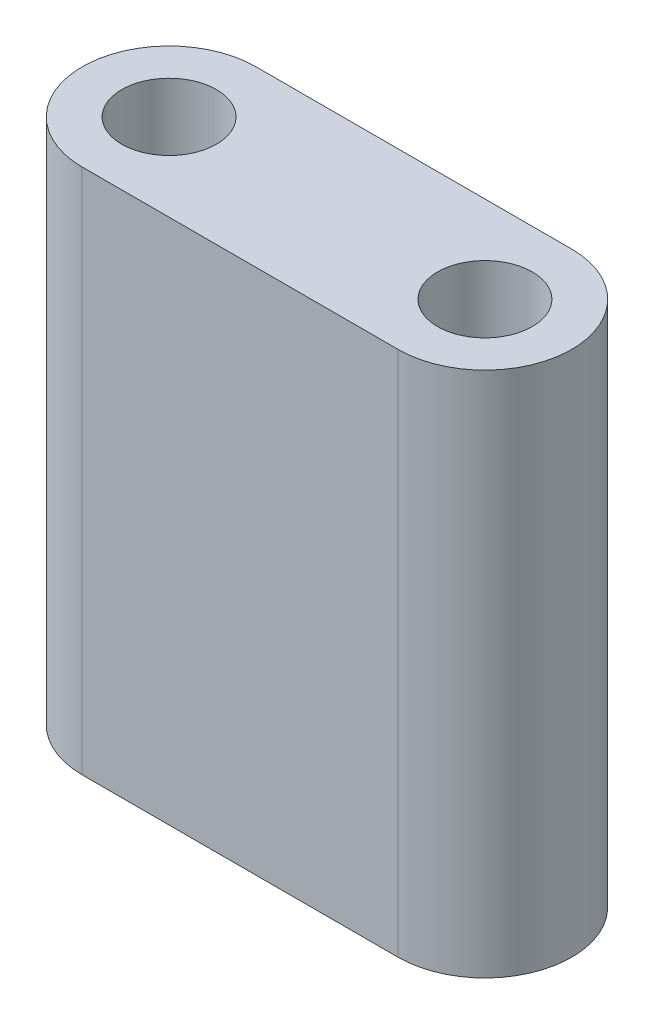
ISO-10303-21;
HEADER;
FILE_DESCRIPTION(('STEP AP214'),'2;1');
FILE_NAME('part.step','',(''),(''),'','','');
FILE_SCHEMA(('AUTOMOTIVE_DESIGN { 1 0 10303 214 1 1 1 1 }'));
ENDSEC;
DATA;
#1=APPLICATION_CONTEXT('core data for automotive mechanical design processes');
#2=APPLICATION_PROTOCOL_DEFINITION('international standard','automotive_design',2000,#1);
#3=PRODUCT_CONTEXT('',#1,'mechanical');
#4=PRODUCT('Part','Part','',(#3));
#5=PRODUCT_RELATED_PRODUCT_CATEGORY('part','',(#4));
#6=PRODUCT_DEFINITION_FORMATION('','',#4);
#7=PRODUCT_DEFINITION_CONTEXT('part definition',#1,'design');
#8=PRODUCT_DEFINITION('design','',#6,#7);
#9=PRODUCT_DEFINITION_SHAPE('','',#8);
#10=(LENGTH_UNIT() NAMED_UNIT(*) SI_UNIT(.MILLI.,.METRE.));
#11=(NAMED_UNIT(*) PLANE_ANGLE_UNIT() SI_UNIT($,.RADIAN.));
#12=(NAMED_UNIT(*) SI_UNIT($,.STERADIAN.) SOLID_ANGLE_UNIT());
#13=UNCERTAINTY_MEASURE_WITH_UNIT(LENGTH_MEASURE(1.E-05),#10,'distance_accuracy_value','');
#14=(GEOMETRIC_REPRESENTATION_CONTEXT(3) GLOBAL_UNCERTAINTY_ASSIGNED_CONTEXT((#13)) GLOBAL_UNIT_ASSIGNED_CONTEXT((#10,
#11,#12)) REPRESENTATION_CONTEXT('',''));
#15=CARTESIAN_POINT('',(0.,0.,0.));
#16=DIRECTION('',(0.,0.,1.));
#17=DIRECTION('',(1.,0.,0.));
#18=AXIS2_PLACEMENT_3D('',#15,#16,#17);
#19=CARTESIAN_POINT('',(0.,20.,0.));
#20=DIRECTION('',(0.,1.,0.));
#21=DIRECTION('',(0.,0.,1.));
#22=AXIS2_PLACEMENT_3D('',#19,#20,#21);
#23=PLANE('',#22);
#24=CARTESIAN_POINT('',(0.,20.,0.));
#25=DIRECTION('',(0.,1.,0.));
#26=DIRECTION('',(0.,0.,1.));
#27=AXIS2_PLACEMENT_3D('',#24,#25,#26);
#28=CIRCLE('',#27,1.8);
#29=CARTESIAN_POINT('',(0.,20.,1.8));
#30=VERTEX_POINT('',#29);
#31=EDGE_CURVE('E106',#30,#30,#28,.T.);
#32=ORIENTED_EDGE('',*,*,#31,.F.);
#33=EDGE_LOOP('',(#32));
#34=FACE_BOUND('',#33,.T.);
#35=CARTESIAN_POINT('',(0.,20.,0.));
#36=DIRECTION('',(0.,1.,0.));
#37=DIRECTION('',(0.,0.,1.));
#38=AXIS2_PLACEMENT_3D('',#35,#36,#37);
#39=CIRCLE('',#38,3.3);
#40=CARTESIAN_POINT('',(0.,20.,-3.3));
#41=VERTEX_POINT('',#40);
#42=CARTESIAN_POINT('',(0.,20.,3.3));
#43=VERTEX_POINT('',#42);
#44=EDGE_CURVE('E91',#41,#43,#39,.T.);
#45=ORIENTED_EDGE('',*,*,#44,.T.);
#46=DIRECTION('',(1.,0.,0.));
#47=VECTOR('',#46,1.);
#48=CARTESIAN_POINT('',(0.,20.,3.3));
#49=LINE('',#48,#47);
#50=CARTESIAN_POINT('',(12.,20.,3.3));
#51=VERTEX_POINT('',#50);
#52=EDGE_CURVE('E86',#43,#51,#49,.T.);
#53=ORIENTED_EDGE('',*,*,#52,.T.);
#54=CARTESIAN_POINT('',(12.,20.,0.));
#55=DIRECTION('',(0.,1.,0.));
#56=DIRECTION('',(0.,0.,1.));
#57=AXIS2_PLACEMENT_3D('',#54,#55,#56);
#58=CIRCLE('',#57,3.3);
#59=CARTESIAN_POINT('',(12.,20.,-3.3));
#60=VERTEX_POINT('',#59);
#61=EDGE_CURVE('E89',#51,#60,#58,.T.);
#62=ORIENTED_EDGE('',*,*,#61,.T.);
#63=DIRECTION('',(-1.,0.,0.));
#64=VECTOR('',#63,1.);
#65=CARTESIAN_POINT('',(0.,20.,-3.3));
#66=LINE('',#65,#64);
#67=EDGE_CURVE('E56',#60,#41,#66,.T.);
#68=ORIENTED_EDGE('',*,*,#67,.T.);
#69=EDGE_LOOP('',(#45,#53,#62,#68));
#70=FACE_BOUND('',#69,.T.);
#71=CARTESIAN_POINT('',(12.,20.,0.));
#72=DIRECTION('',(0.,1.,0.));
#73=DIRECTION('',(0.,0.,-1.));
#74=AXIS2_PLACEMENT_3D('',#71,#72,#73);
#75=CIRCLE('',#74,1.8);
#76=CARTESIAN_POINT('',(12.,20.,-1.8));
#77=VERTEX_POINT('',#76);
#78=EDGE_CURVE('E121',#77,#77,#75,.T.);
#79=ORIENTED_EDGE('',*,*,#78,.F.);
#80=EDGE_LOOP('',(#79));
#81=FACE_BOUND('',#80,.T.);
#82=ADVANCED_FACE('F39',(#34,#70,#81),#23,.T.);
#83=CARTESIAN_POINT('',(0.,0.,0.));
#84=DIRECTION('',(0.,1.,0.));
#85=DIRECTION('',(0.,0.,1.));
#86=AXIS2_PLACEMENT_3D('',#83,#84,#85);
#87=PLANE('',#86);
#88=CARTESIAN_POINT('',(0.,0.,0.));
#89=DIRECTION('',(0.,1.,0.));
#90=DIRECTION('',(0.,0.,1.));
#91=AXIS2_PLACEMENT_3D('',#88,#89,#90);
#92=CIRCLE('',#91,3.3);
#93=CARTESIAN_POINT('',(0.,0.,-3.3));
#94=VERTEX_POINT('',#93);
#95=CARTESIAN_POINT('',(0.,0.,3.3));
#96=VERTEX_POINT('',#95);
#97=EDGE_CURVE('E103',#94,#96,#92,.T.);
#98=ORIENTED_EDGE('',*,*,#97,.F.);
#99=DIRECTION('',(-1.,0.,0.));
#100=VECTOR('',#99,1.);
#101=CARTESIAN_POINT('',(0.,0.,-3.3));
#102=LINE('',#101,#100);
#103=CARTESIAN_POINT('',(12.,0.,-3.3));
#104=VERTEX_POINT('',#103);
#105=EDGE_CURVE('E79',#104,#94,#102,.T.);
#106=ORIENTED_EDGE('',*,*,#105,.F.);
#107=CARTESIAN_POINT('',(12.,0.,0.));
#108=DIRECTION('',(0.,1.,0.));
#109=DIRECTION('',(0.,0.,1.));
#110=AXIS2_PLACEMENT_3D('',#107,#108,#109);
#111=CIRCLE('',#110,3.3);
#112=CARTESIAN_POINT('',(12.,0.,3.3));
#113=VERTEX_POINT('',#112);
#114=EDGE_CURVE('E73',#113,#104,#111,.T.);
#115=ORIENTED_EDGE('',*,*,#114,.F.);
#116=DIRECTION('',(1.,0.,0.));
#117=VECTOR('',#116,1.);
#118=CARTESIAN_POINT('',(0.,0.,3.3));
#119=LINE('',#118,#117);
#120=EDGE_CURVE('E95',#96,#113,#119,.T.);
#121=ORIENTED_EDGE('',*,*,#120,.F.);
#122=EDGE_LOOP('',(#98,#106,#115,#121));
#123=FACE_BOUND('',#122,.T.);
#124=CARTESIAN_POINT('',(0.,0.,0.));
#125=DIRECTION('',(0.,1.,0.));
#126=DIRECTION('',(0.,0.,1.));
#127=AXIS2_PLACEMENT_3D('',#124,#125,#126);
#128=CIRCLE('',#127,1.8);
#129=CARTESIAN_POINT('',(0.,0.,1.8));
#130=VERTEX_POINT('',#129);
#131=EDGE_CURVE('E118',#130,#130,#128,.T.);
#132=ORIENTED_EDGE('',*,*,#131,.T.);
#133=EDGE_LOOP('',(#132));
#134=FACE_BOUND('',#133,.T.);
#135=CARTESIAN_POINT('',(12.,0.,0.));
#136=DIRECTION('',(0.,1.,0.));
#137=DIRECTION('',(0.,0.,-1.));
#138=AXIS2_PLACEMENT_3D('',#135,#136,#137);
#139=CIRCLE('',#138,1.8);
#140=CARTESIAN_POINT('',(12.,0.,-1.8));
#141=VERTEX_POINT('',#140);
#142=EDGE_CURVE('E124',#141,#141,#139,.T.);
#143=ORIENTED_EDGE('',*,*,#142,.T.);
#144=EDGE_LOOP('',(#143));
#145=FACE_BOUND('',#144,.T.);
#146=ADVANCED_FACE('F114',(#123,#134,#145),#87,.F.);
#147=CARTESIAN_POINT('',(0.,20.,0.));
#148=DIRECTION('',(0.,-1.,0.));
#149=DIRECTION('',(0.,0.,-1.));
#150=AXIS2_PLACEMENT_3D('',#147,#148,#149);
#151=CYLINDRICAL_SURFACE('',#150,3.3);
#152=ORIENTED_EDGE('',*,*,#97,.T.);
#153=DIRECTION('',(0.,-1.,0.));
#154=VECTOR('',#153,1.);
#155=CARTESIAN_POINT('',(0.,20.,3.3));
#156=LINE('',#155,#154);
#157=EDGE_CURVE('E11',#43,#96,#156,.T.);
#158=ORIENTED_EDGE('',*,*,#157,.F.);
#159=ORIENTED_EDGE('',*,*,#44,.F.);
#160=DIRECTION('',(0.,-1.,0.));
#161=VECTOR('',#160,1.);
#162=CARTESIAN_POINT('',(0.,20.,-3.3));
#163=LINE('',#162,#161);
#164=EDGE_CURVE('E99',#41,#94,#163,.T.);
#165=ORIENTED_EDGE('',*,*,#164,.T.);
#166=EDGE_LOOP('',(#152,#158,#159,#165));
#167=FACE_BOUND('',#166,.T.);
#168=ADVANCED_FACE('F41',(#167),#151,.T.);
#169=CARTESIAN_POINT('',(0.,20.,3.3));
#170=DIRECTION('',(0.,0.,-1.));
#171=DIRECTION('',(-1.,0.,0.));
#172=AXIS2_PLACEMENT_3D('',#169,#170,#171);
#173=PLANE('',#172);
#174=ORIENTED_EDGE('',*,*,#120,.T.);
#175=DIRECTION('',(0.,-1.,0.));
#176=VECTOR('',#175,1.);
#177=CARTESIAN_POINT('',(12.,20.,3.3));
#178=LINE('',#177,#176);
#179=EDGE_CURVE('E48',#51,#113,#178,.T.);
#180=ORIENTED_EDGE('',*,*,#179,.F.);
#181=ORIENTED_EDGE('',*,*,#52,.F.);
#182=ORIENTED_EDGE('',*,*,#157,.T.);
#183=EDGE_LOOP('',(#174,#180,#181,#182));
#184=FACE_BOUND('',#183,.T.);
#185=ADVANCED_FACE('F94',(#184),#173,.F.);
#186=CARTESIAN_POINT('',(12.,20.,0.));
#187=DIRECTION('',(0.,-1.,0.));
#188=DIRECTION('',(0.,0.,-1.));
#189=AXIS2_PLACEMENT_3D('',#186,#187,#188);
#190=CYLINDRICAL_SURFACE('',#189,3.3);
#191=ORIENTED_EDGE('',*,*,#114,.T.);
#192=DIRECTION('',(0.,-1.,0.));
#193=VECTOR('',#192,1.);
#194=CARTESIAN_POINT('',(12.,20.,-3.3));
#195=LINE('',#194,#193);
#196=EDGE_CURVE('E96',#60,#104,#195,.T.);
#197=ORIENTED_EDGE('',*,*,#196,.F.);
#198=ORIENTED_EDGE('',*,*,#61,.F.);
#199=ORIENTED_EDGE('',*,*,#179,.T.);
#200=EDGE_LOOP('',(#191,#197,#198,#199));
#201=FACE_BOUND('',#200,.T.);
#202=ADVANCED_FACE('F97',(#201),#190,.T.);
#203=CARTESIAN_POINT('',(0.,20.,-3.3));
#204=DIRECTION('',(0.,0.,1.));
#205=DIRECTION('',(1.,0.,0.));
#206=AXIS2_PLACEMENT_3D('',#203,#204,#205);
#207=PLANE('',#206);
#208=ORIENTED_EDGE('',*,*,#105,.T.);
#209=ORIENTED_EDGE('',*,*,#164,.F.);
#210=ORIENTED_EDGE('',*,*,#67,.F.);
#211=ORIENTED_EDGE('',*,*,#196,.T.);
#212=EDGE_LOOP('',(#208,#209,#210,#211));
#213=FACE_BOUND('',#212,.T.);
#214=ADVANCED_FACE('F111',(#213),#207,.F.);
#215=CARTESIAN_POINT('',(0.,20.,0.));
#216=DIRECTION('',(0.,-1.,0.));
#217=DIRECTION('',(0.,0.,-1.));
#218=AXIS2_PLACEMENT_3D('',#215,#216,#217);
#219=CYLINDRICAL_SURFACE('',#218,1.8);
#220=ORIENTED_EDGE('',*,*,#31,.T.);
#221=EDGE_LOOP('',(#220));
#222=FACE_BOUND('',#221,.T.);
#223=ORIENTED_EDGE('',*,*,#131,.F.);
#224=EDGE_LOOP('',(#223));
#225=FACE_BOUND('',#224,.T.);
#226=ADVANCED_FACE('F141',(#222,#225),#219,.F.);
#227=CARTESIAN_POINT('',(12.,20.,0.));
#228=DIRECTION('',(0.,-1.,0.));
#229=DIRECTION('',(0.,0.,-1.));
#230=AXIS2_PLACEMENT_3D('',#227,#228,#229);
#231=CYLINDRICAL_SURFACE('',#230,1.8);
#232=ORIENTED_EDGE('',*,*,#78,.T.);
#233=EDGE_LOOP('',(#232));
#234=FACE_BOUND('',#233,.T.);
#235=ORIENTED_EDGE('',*,*,#142,.F.);
#236=EDGE_LOOP('',(#235));
#237=FACE_BOUND('',#236,.T.);
#238=ADVANCED_FACE('F130',(#234,#237),#231,.F.);
#239=CLOSED_SHELL('',(#82,#146,#168,#185,#202,#214,#226,#238));
#240=MANIFOLD_SOLID_BREP('B2',#239);
#241=ADVANCED_BREP_SHAPE_REPRESENTATION('',(#18,#240),#14);
#242=SHAPE_DEFINITION_REPRESENTATION(#9,#241);
ENDSEC;
END-ISO-10303-21;
